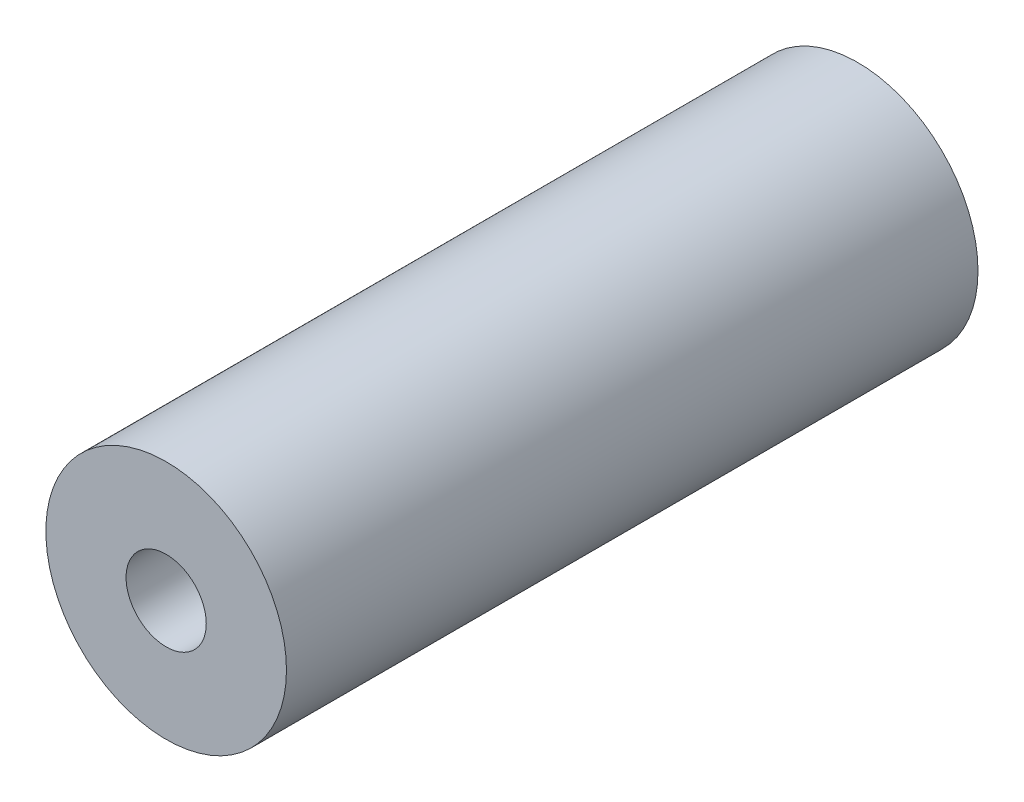
ISO-10303-21;
HEADER;
FILE_DESCRIPTION(('STEP AP214'),'2;1');
FILE_NAME('part.step','',(''),(''),'','','');
FILE_SCHEMA(('AUTOMOTIVE_DESIGN { 1 0 10303 214 1 1 1 1 }'));
ENDSEC;
DATA;
#1=APPLICATION_CONTEXT('core data for automotive mechanical design processes');
#2=APPLICATION_PROTOCOL_DEFINITION('international standard','automotive_design',2000,#1);
#3=PRODUCT_CONTEXT('',#1,'mechanical');
#4=PRODUCT('Part','Part','',(#3));
#5=PRODUCT_RELATED_PRODUCT_CATEGORY('part','',(#4));
#6=PRODUCT_DEFINITION_FORMATION('','',#4);
#7=PRODUCT_DEFINITION_CONTEXT('part definition',#1,'design');
#8=PRODUCT_DEFINITION('design','',#6,#7);
#9=PRODUCT_DEFINITION_SHAPE('','',#8);
#10=(LENGTH_UNIT() NAMED_UNIT(*) SI_UNIT(.MILLI.,.METRE.));
#11=(NAMED_UNIT(*) PLANE_ANGLE_UNIT() SI_UNIT($,.RADIAN.));
#12=(NAMED_UNIT(*) SI_UNIT($,.STERADIAN.) SOLID_ANGLE_UNIT());
#13=UNCERTAINTY_MEASURE_WITH_UNIT(LENGTH_MEASURE(1.E-05),#10,'distance_accuracy_value','');
#14=(GEOMETRIC_REPRESENTATION_CONTEXT(3) GLOBAL_UNCERTAINTY_ASSIGNED_CONTEXT((#13)) GLOBAL_UNIT_ASSIGNED_CONTEXT((#10,
#11,#12)) REPRESENTATION_CONTEXT('',''));
#15=CARTESIAN_POINT('',(0.,0.,0.));
#16=DIRECTION('',(0.,0.,1.));
#17=DIRECTION('',(1.,0.,0.));
#18=AXIS2_PLACEMENT_3D('',#15,#16,#17);
#19=CARTESIAN_POINT('',(0.,0.,54.75));
#20=DIRECTION('',(0.,0.,1.));
#21=DIRECTION('',(1.,0.,0.));
#22=AXIS2_PLACEMENT_3D('',#19,#20,#21);
#23=PLANE('',#22);
#24=CARTESIAN_POINT('',(0.,0.,54.75));
#25=DIRECTION('',(0.,0.,1.));
#26=DIRECTION('',(1.,0.,0.));
#27=AXIS2_PLACEMENT_3D('',#24,#25,#26);
#28=CIRCLE('',#27,19.05);
#29=CARTESIAN_POINT('',(19.05,0.,54.75));
#30=VERTEX_POINT('',#29);
#31=EDGE_CURVE('E10',#30,#30,#28,.T.);
#32=ORIENTED_EDGE('',*,*,#31,.T.);
#33=EDGE_LOOP('',(#32));
#34=FACE_BOUND('',#33,.T.);
#35=CARTESIAN_POINT('',(0.,0.,54.75));
#36=DIRECTION('',(0.,0.,1.));
#37=DIRECTION('',(1.,0.,0.));
#38=AXIS2_PLACEMENT_3D('',#35,#36,#37);
#39=CIRCLE('',#38,6.35);
#40=CARTESIAN_POINT('',(6.35,0.,54.75));
#41=VERTEX_POINT('',#40);
#42=EDGE_CURVE('E42',#41,#41,#39,.T.);
#43=ORIENTED_EDGE('',*,*,#42,.F.);
#44=EDGE_LOOP('',(#43));
#45=FACE_BOUND('',#44,.T.);
#46=ADVANCED_FACE('F31',(#34,#45),#23,.T.);
#47=CARTESIAN_POINT('',(0.,0.,-54.75));
#48=DIRECTION('',(0.,0.,1.));
#49=DIRECTION('',(1.,0.,0.));
#50=AXIS2_PLACEMENT_3D('',#47,#48,#49);
#51=PLANE('',#50);
#52=CARTESIAN_POINT('',(0.,0.,-54.75));
#53=DIRECTION('',(0.,0.,1.));
#54=DIRECTION('',(1.,0.,0.));
#55=AXIS2_PLACEMENT_3D('',#52,#53,#54);
#56=CIRCLE('',#55,19.05);
#57=CARTESIAN_POINT('',(19.05,0.,-54.75));
#58=VERTEX_POINT('',#57);
#59=EDGE_CURVE('E35',#58,#58,#56,.T.);
#60=ORIENTED_EDGE('',*,*,#59,.F.);
#61=EDGE_LOOP('',(#60));
#62=FACE_BOUND('',#61,.T.);
#63=CARTESIAN_POINT('',(0.,0.,-54.75));
#64=DIRECTION('',(0.,0.,1.));
#65=DIRECTION('',(1.,0.,0.));
#66=AXIS2_PLACEMENT_3D('',#63,#64,#65);
#67=CIRCLE('',#66,6.35);
#68=CARTESIAN_POINT('',(6.35,0.,-54.75));
#69=VERTEX_POINT('',#68);
#70=EDGE_CURVE('E44',#69,#69,#67,.T.);
#71=ORIENTED_EDGE('',*,*,#70,.T.);
#72=EDGE_LOOP('',(#71));
#73=FACE_BOUND('',#72,.T.);
#74=ADVANCED_FACE('F54',(#62,#73),#51,.F.);
#75=CARTESIAN_POINT('',(0.,0.,54.75));
#76=DIRECTION('',(0.,0.,-1.));
#77=DIRECTION('',(-1.,0.,0.));
#78=AXIS2_PLACEMENT_3D('',#75,#76,#77);
#79=CYLINDRICAL_SURFACE('',#78,19.05);
#80=ORIENTED_EDGE('',*,*,#31,.F.);
#81=EDGE_LOOP('',(#80));
#82=FACE_BOUND('',#81,.T.);
#83=ORIENTED_EDGE('',*,*,#59,.T.);
#84=EDGE_LOOP('',(#83));
#85=FACE_BOUND('',#84,.T.);
#86=ADVANCED_FACE('F33',(#82,#85),#79,.T.);
#87=CARTESIAN_POINT('',(0.,0.,54.75));
#88=DIRECTION('',(0.,0.,-1.));
#89=DIRECTION('',(-1.,0.,0.));
#90=AXIS2_PLACEMENT_3D('',#87,#88,#89);
#91=CYLINDRICAL_SURFACE('',#90,6.35);
#92=ORIENTED_EDGE('',*,*,#42,.T.);
#93=EDGE_LOOP('',(#92));
#94=FACE_BOUND('',#93,.T.);
#95=ORIENTED_EDGE('',*,*,#70,.F.);
#96=EDGE_LOOP('',(#95));
#97=FACE_BOUND('',#96,.T.);
#98=ADVANCED_FACE('F50',(#94,#97),#91,.F.);
#99=CLOSED_SHELL('',(#46,#74,#86,#98));
#100=MANIFOLD_SOLID_BREP('B2',#99);
#101=ADVANCED_BREP_SHAPE_REPRESENTATION('',(#18,#100),#14);
#102=SHAPE_DEFINITION_REPRESENTATION(#9,#101);
ENDSEC;
END-ISO-10303-21;
